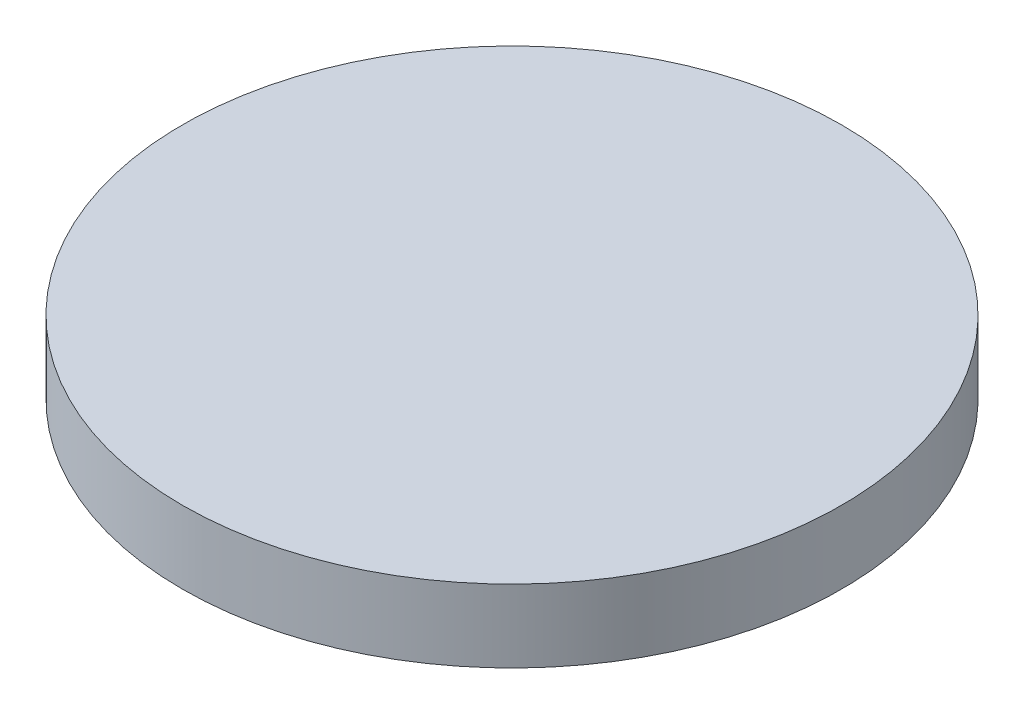
ISO-10303-21;
HEADER;
FILE_DESCRIPTION(('STEP AP214'),'2;1');
FILE_NAME('part.step','',(''),(''),'','','');
FILE_SCHEMA(('AUTOMOTIVE_DESIGN { 1 0 10303 214 1 1 1 1 }'));
ENDSEC;
DATA;
#1=APPLICATION_CONTEXT('core data for automotive mechanical design processes');
#2=APPLICATION_PROTOCOL_DEFINITION('international standard','automotive_design',2000,#1);
#3=PRODUCT_CONTEXT('',#1,'mechanical');
#4=PRODUCT('Part','Part','',(#3));
#5=PRODUCT_RELATED_PRODUCT_CATEGORY('part','',(#4));
#6=PRODUCT_DEFINITION_FORMATION('','',#4);
#7=PRODUCT_DEFINITION_CONTEXT('part definition',#1,'design');
#8=PRODUCT_DEFINITION('design','',#6,#7);
#9=PRODUCT_DEFINITION_SHAPE('','',#8);
#10=(LENGTH_UNIT() NAMED_UNIT(*) SI_UNIT(.MILLI.,.METRE.));
#11=(NAMED_UNIT(*) PLANE_ANGLE_UNIT() SI_UNIT($,.RADIAN.));
#12=(NAMED_UNIT(*) SI_UNIT($,.STERADIAN.) SOLID_ANGLE_UNIT());
#13=UNCERTAINTY_MEASURE_WITH_UNIT(LENGTH_MEASURE(1.E-05),#10,'distance_accuracy_value','');
#14=(GEOMETRIC_REPRESENTATION_CONTEXT(3) GLOBAL_UNCERTAINTY_ASSIGNED_CONTEXT((#13)) GLOBAL_UNIT_ASSIGNED_CONTEXT((#10,
#11,#12)) REPRESENTATION_CONTEXT('',''));
#15=CARTESIAN_POINT('',(0.,0.,0.));
#16=DIRECTION('',(0.,0.,1.));
#17=DIRECTION('',(1.,0.,0.));
#18=AXIS2_PLACEMENT_3D('',#15,#16,#17);
#19=CARTESIAN_POINT('',(0.,3.499993,0.));
#20=DIRECTION('',(0.,-1.,0.));
#21=DIRECTION('',(0.,0.,-1.));
#22=AXIS2_PLACEMENT_3D('',#19,#20,#21);
#23=CYLINDRICAL_SURFACE('',#22,15.875);
#24=CARTESIAN_POINT('',(0.,3.499993,0.));
#25=DIRECTION('',(0.,1.,0.));
#26=DIRECTION('',(0.,0.,1.));
#27=AXIS2_PLACEMENT_3D('',#24,#25,#26);
#28=CIRCLE('',#27,15.875);
#29=CARTESIAN_POINT('',(0.,3.499993,15.875));
#30=VERTEX_POINT('',#29);
#31=EDGE_CURVE('E10',#30,#30,#28,.T.);
#32=ORIENTED_EDGE('',*,*,#31,.F.);
#33=EDGE_LOOP('',(#32));
#34=FACE_BOUND('',#33,.T.);
#35=CARTESIAN_POINT('',(0.,0.,0.));
#36=DIRECTION('',(0.,1.,0.));
#37=DIRECTION('',(0.,0.,1.));
#38=AXIS2_PLACEMENT_3D('',#35,#36,#37);
#39=CIRCLE('',#38,15.875);
#40=CARTESIAN_POINT('',(0.,0.,15.875));
#41=VERTEX_POINT('',#40);
#42=EDGE_CURVE('E40',#41,#41,#39,.T.);
#43=ORIENTED_EDGE('',*,*,#42,.T.);
#44=EDGE_LOOP('',(#43));
#45=FACE_BOUND('',#44,.T.);
#46=ADVANCED_FACE('F37',(#34,#45),#23,.T.);
#47=CARTESIAN_POINT('',(0.,3.499993,0.));
#48=DIRECTION('',(0.,1.,0.));
#49=DIRECTION('',(0.,0.,1.));
#50=AXIS2_PLACEMENT_3D('',#47,#48,#49);
#51=PLANE('',#50);
#52=ORIENTED_EDGE('',*,*,#31,.T.);
#53=EDGE_LOOP('',(#52));
#54=FACE_BOUND('',#53,.T.);
#55=ADVANCED_FACE('F54',(#54),#51,.T.);
#56=CARTESIAN_POINT('',(0.,0.,0.));
#57=DIRECTION('',(0.,1.,0.));
#58=DIRECTION('',(0.,0.,1.));
#59=AXIS2_PLACEMENT_3D('',#56,#57,#58);
#60=PLANE('',#59);
#61=ORIENTED_EDGE('',*,*,#42,.F.);
#62=EDGE_LOOP('',(#61));
#63=FACE_BOUND('',#62,.T.);
#64=ADVANCED_FACE('F52',(#63),#60,.F.);
#65=CLOSED_SHELL('',(#46,#55,#64));
#66=MANIFOLD_SOLID_BREP('B2',#65);
#67=ADVANCED_BREP_SHAPE_REPRESENTATION('',(#18,#66),#14);
#68=SHAPE_DEFINITION_REPRESENTATION(#9,#67);
ENDSEC;
END-ISO-10303-21;
